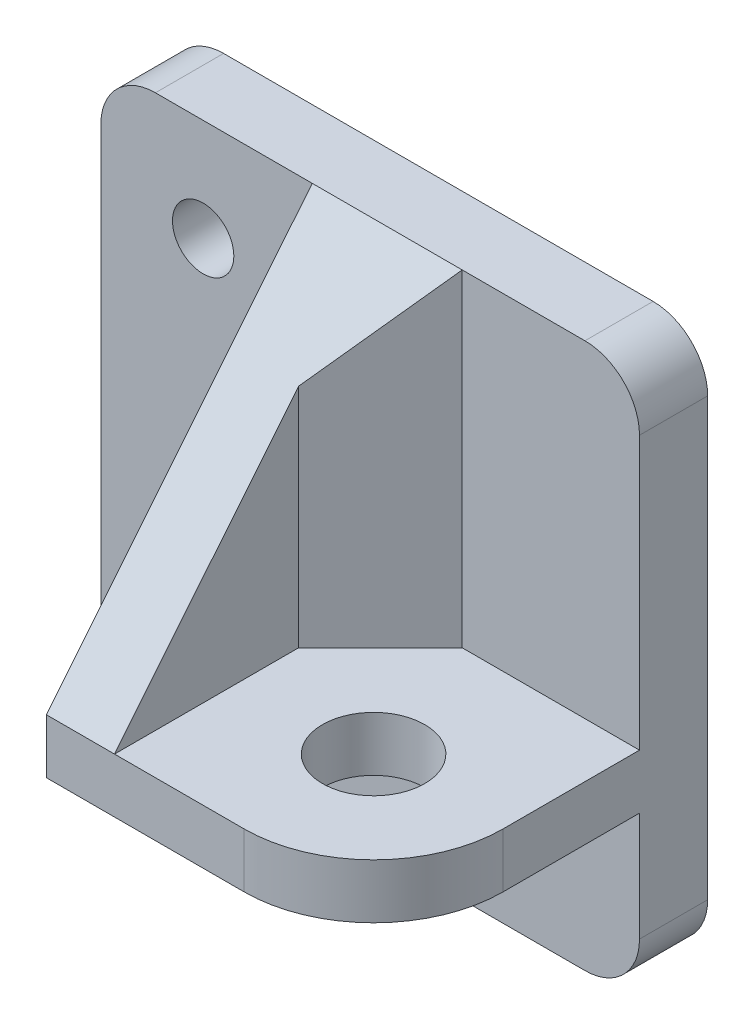
ISO-10303-21;
HEADER;
FILE_DESCRIPTION(('STEP AP214'),'2;1');
FILE_NAME('part.step','',(''),(''),'','','');
FILE_SCHEMA(('AUTOMOTIVE_DESIGN { 1 0 10303 214 1 1 1 1 }'));
ENDSEC;
DATA;
#1=APPLICATION_CONTEXT('core data for automotive mechanical design processes');
#2=APPLICATION_PROTOCOL_DEFINITION('international standard','automotive_design',2000,#1);
#3=PRODUCT_CONTEXT('',#1,'mechanical');
#4=PRODUCT('Part','Part','',(#3));
#5=PRODUCT_RELATED_PRODUCT_CATEGORY('part','',(#4));
#6=PRODUCT_DEFINITION_FORMATION('','',#4);
#7=PRODUCT_DEFINITION_CONTEXT('part definition',#1,'design');
#8=PRODUCT_DEFINITION('design','',#6,#7);
#9=PRODUCT_DEFINITION_SHAPE('','',#8);
#10=(LENGTH_UNIT() NAMED_UNIT(*) SI_UNIT(.MILLI.,.METRE.));
#11=(NAMED_UNIT(*) PLANE_ANGLE_UNIT() SI_UNIT($,.RADIAN.));
#12=(NAMED_UNIT(*) SI_UNIT($,.STERADIAN.) SOLID_ANGLE_UNIT());
#13=UNCERTAINTY_MEASURE_WITH_UNIT(LENGTH_MEASURE(1.E-05),#10,'distance_accuracy_value','');
#14=(GEOMETRIC_REPRESENTATION_CONTEXT(3) GLOBAL_UNCERTAINTY_ASSIGNED_CONTEXT((#13)) GLOBAL_UNIT_ASSIGNED_CONTEXT((#10,
#11,#12)) REPRESENTATION_CONTEXT('',''));
#15=CARTESIAN_POINT('',(0.,0.,0.));
#16=DIRECTION('',(0.,0.,1.));
#17=DIRECTION('',(1.,0.,0.));
#18=AXIS2_PLACEMENT_3D('',#15,#16,#17);
#19=CARTESIAN_POINT('',(0.,0.,5.));
#20=DIRECTION('',(0.,0.,1.));
#21=DIRECTION('',(1.,0.,0.));
#22=AXIS2_PLACEMENT_3D('',#19,#20,#21);
#23=PLANE('',#22);
#24=CARTESIAN_POINT('',(0.,12.5,5.));
#25=DIRECTION('',(0.,0.,1.));
#26=DIRECTION('',(1.,0.,0.));
#27=AXIS2_PLACEMENT_3D('',#24,#25,#26);
#28=CIRCLE('',#27,2.25);
#29=CARTESIAN_POINT('',(2.25,12.5,5.));
#30=VERTEX_POINT('',#29);
#31=EDGE_CURVE('E242',#30,#30,#28,.T.);
#32=ORIENTED_EDGE('',*,*,#31,.F.);
#33=EDGE_LOOP('',(#32));
#34=FACE_BOUND('',#33,.T.);
#35=CARTESIAN_POINT('',(0.,-12.5,5.));
#36=DIRECTION('',(0.,0.,1.));
#37=DIRECTION('',(1.,0.,0.));
#38=AXIS2_PLACEMENT_3D('',#35,#36,#37);
#39=CIRCLE('',#38,2.25);
#40=CARTESIAN_POINT('',(2.25,-12.5,5.));
#41=VERTEX_POINT('',#40);
#42=EDGE_CURVE('E236',#41,#41,#39,.T.);
#43=ORIENTED_EDGE('',*,*,#42,.F.);
#44=EDGE_LOOP('',(#43));
#45=FACE_BOUND('',#44,.T.);
#46=DIRECTION('',(1.,0.,0.));
#47=VECTOR('',#46,1.);
#48=CARTESIAN_POINT('',(-7.49999999999999,-20.,5.));
#49=LINE('',#48,#47);
#50=CARTESIAN_POINT('',(-3.5,-20.,5.));
#51=VERTEX_POINT('',#50);
#52=CARTESIAN_POINT('',(28.,-20.,5.));
#53=VERTEX_POINT('',#52);
#54=EDGE_CURVE('E251',#51,#53,#49,.T.);
#55=ORIENTED_EDGE('',*,*,#54,.T.);
#56=CARTESIAN_POINT('',(28.,-16.,5.));
#57=DIRECTION('',(0.,0.,1.));
#58=DIRECTION('',(1.,0.,0.));
#59=AXIS2_PLACEMENT_3D('',#56,#57,#58);
#60=CIRCLE('',#59,4.);
#61=CARTESIAN_POINT('',(32.,-16.,5.));
#62=VERTEX_POINT('',#61);
#63=EDGE_CURVE('E290',#53,#62,#60,.T.);
#64=ORIENTED_EDGE('',*,*,#63,.T.);
#65=DIRECTION('',(0.,1.,0.));
#66=VECTOR('',#65,1.);
#67=CARTESIAN_POINT('',(32.,20.,5.));
#68=LINE('',#67,#66);
#69=CARTESIAN_POINT('',(32.,-8.,5.));
#70=VERTEX_POINT('',#69);
#71=EDGE_CURVE('E152',#62,#70,#68,.T.);
#72=ORIENTED_EDGE('',*,*,#71,.T.);
#73=DIRECTION('',(1.,0.,0.));
#74=VECTOR('',#73,1.);
#75=CARTESIAN_POINT('',(32.,-8.,5.));
#76=LINE('',#75,#74);
#77=CARTESIAN_POINT('',(7.99999999999999,-8.,5.));
#78=VERTEX_POINT('',#77);
#79=EDGE_CURVE('E145',#78,#70,#76,.T.);
#80=ORIENTED_EDGE('',*,*,#79,.F.);
#81=DIRECTION('',(0.,-1.,0.));
#82=VECTOR('',#81,1.);
#83=CARTESIAN_POINT('',(7.99999999999999,-8.,5.));
#84=LINE('',#83,#82);
#85=CARTESIAN_POINT('',(7.99999999999999,20.,5.));
#86=VERTEX_POINT('',#85);
#87=EDGE_CURVE('E150',#86,#78,#84,.T.);
#88=ORIENTED_EDGE('',*,*,#87,.F.);
#89=DIRECTION('',(-1.,0.,0.));
#90=VECTOR('',#89,1.);
#91=CARTESIAN_POINT('',(-7.5,20.,5.));
#92=LINE('',#91,#90);
#93=CARTESIAN_POINT('',(-3.5,20.,5.));
#94=VERTEX_POINT('',#93);
#95=EDGE_CURVE('E266',#86,#94,#92,.T.);
#96=ORIENTED_EDGE('',*,*,#95,.T.);
#97=CARTESIAN_POINT('',(-3.5,16.,5.));
#98=DIRECTION('',(0.,0.,1.));
#99=DIRECTION('',(1.,0.,0.));
#100=AXIS2_PLACEMENT_3D('',#97,#98,#99);
#101=CIRCLE('',#100,4.);
#102=CARTESIAN_POINT('',(-7.5,16.,5.));
#103=VERTEX_POINT('',#102);
#104=EDGE_CURVE('E286',#94,#103,#101,.T.);
#105=ORIENTED_EDGE('',*,*,#104,.T.);
#106=DIRECTION('',(0.,-1.,0.));
#107=VECTOR('',#106,1.);
#108=CARTESIAN_POINT('',(-7.5,20.,5.));
#109=LINE('',#108,#107);
#110=CARTESIAN_POINT('',(-7.5,-16.,5.));
#111=VERTEX_POINT('',#110);
#112=EDGE_CURVE('E248',#103,#111,#109,.T.);
#113=ORIENTED_EDGE('',*,*,#112,.T.);
#114=CARTESIAN_POINT('',(-3.5,-16.,5.));
#115=DIRECTION('',(0.,0.,1.));
#116=DIRECTION('',(1.,0.,0.));
#117=AXIS2_PLACEMENT_3D('',#114,#115,#116);
#118=CIRCLE('',#117,4.);
#119=EDGE_CURVE('E288',#111,#51,#118,.T.);
#120=ORIENTED_EDGE('',*,*,#119,.T.);
#121=EDGE_LOOP('',(#55,#64,#72,#80,#88,#96,#105,#113,#120));
#122=FACE_BOUND('',#121,.T.);
#123=ADVANCED_FACE('F32',(#34,#45,#122),#23,.T.);
#124=CARTESIAN_POINT('',(28.,20.,5.));
#125=VERTEX_POINT('',#124);
#126=CARTESIAN_POINT('',(19.,20.,5.));
#127=VERTEX_POINT('',#126);
#128=EDGE_CURVE('E257',#125,#127,#92,.T.);
#129=ORIENTED_EDGE('',*,*,#128,.T.);
#130=DIRECTION('',(0.,-1.,0.));
#131=VECTOR('',#130,1.);
#132=CARTESIAN_POINT('',(19.,-4.,5.));
#133=LINE('',#132,#131);
#134=CARTESIAN_POINT('',(19.,-4.,5.));
#135=VERTEX_POINT('',#134);
#136=EDGE_CURVE('E206',#127,#135,#133,.T.);
#137=ORIENTED_EDGE('',*,*,#136,.T.);
#138=DIRECTION('',(1.,0.,0.));
#139=VECTOR('',#138,1.);
#140=CARTESIAN_POINT('',(32.,-4.,5.));
#141=LINE('',#140,#139);
#142=CARTESIAN_POINT('',(32.,-4.,5.));
#143=VERTEX_POINT('',#142);
#144=EDGE_CURVE('E195',#135,#143,#141,.T.);
#145=ORIENTED_EDGE('',*,*,#144,.T.);
#146=CARTESIAN_POINT('',(32.,16.,5.));
#147=VERTEX_POINT('',#146);
#148=EDGE_CURVE('E254',#143,#147,#68,.T.);
#149=ORIENTED_EDGE('',*,*,#148,.T.);
#150=CARTESIAN_POINT('',(28.,16.,5.));
#151=DIRECTION('',(0.,0.,1.));
#152=DIRECTION('',(1.,0.,0.));
#153=AXIS2_PLACEMENT_3D('',#150,#151,#152);
#154=CIRCLE('',#153,4.);
#155=EDGE_CURVE('E297',#147,#125,#154,.T.);
#156=ORIENTED_EDGE('',*,*,#155,.T.);
#157=EDGE_LOOP('',(#129,#137,#145,#149,#156));
#158=FACE_BOUND('',#157,.T.);
#159=ADVANCED_FACE('F342',(#158),#23,.T.);
#160=CARTESIAN_POINT('',(0.,0.,0.));
#161=DIRECTION('',(0.,0.,1.));
#162=DIRECTION('',(1.,0.,0.));
#163=AXIS2_PLACEMENT_3D('',#160,#161,#162);
#164=PLANE('',#163);
#165=CARTESIAN_POINT('',(0.,12.5,0.));
#166=DIRECTION('',(0.,0.,1.));
#167=DIRECTION('',(1.,0.,0.));
#168=AXIS2_PLACEMENT_3D('',#165,#166,#167);
#169=CIRCLE('',#168,2.25);
#170=CARTESIAN_POINT('',(2.25,12.5,0.));
#171=VERTEX_POINT('',#170);
#172=EDGE_CURVE('E239',#171,#171,#169,.T.);
#173=ORIENTED_EDGE('',*,*,#172,.T.);
#174=EDGE_LOOP('',(#173));
#175=FACE_BOUND('',#174,.T.);
#176=DIRECTION('',(0.,1.,0.));
#177=VECTOR('',#176,1.);
#178=CARTESIAN_POINT('',(32.,20.,0.));
#179=LINE('',#178,#177);
#180=CARTESIAN_POINT('',(32.,-16.,0.));
#181=VERTEX_POINT('',#180);
#182=CARTESIAN_POINT('',(32.,16.,0.));
#183=VERTEX_POINT('',#182);
#184=EDGE_CURVE('E323',#181,#183,#179,.T.);
#185=ORIENTED_EDGE('',*,*,#184,.F.);
#186=CARTESIAN_POINT('',(28.,-16.,0.));
#187=DIRECTION('',(0.,0.,1.));
#188=DIRECTION('',(1.,0.,0.));
#189=AXIS2_PLACEMENT_3D('',#186,#187,#188);
#190=CIRCLE('',#189,4.);
#191=CARTESIAN_POINT('',(28.,-20.,0.));
#192=VERTEX_POINT('',#191);
#193=EDGE_CURVE('E279',#181,#192,#190,.F.);
#194=ORIENTED_EDGE('',*,*,#193,.T.);
#195=DIRECTION('',(1.,0.,0.));
#196=VECTOR('',#195,1.);
#197=CARTESIAN_POINT('',(-7.49999999999999,-20.,0.));
#198=LINE('',#197,#196);
#199=CARTESIAN_POINT('',(-3.5,-20.,0.));
#200=VERTEX_POINT('',#199);
#201=EDGE_CURVE('E317',#200,#192,#198,.T.);
#202=ORIENTED_EDGE('',*,*,#201,.F.);
#203=CARTESIAN_POINT('',(-3.5,-16.,0.));
#204=DIRECTION('',(0.,0.,1.));
#205=DIRECTION('',(1.,0.,0.));
#206=AXIS2_PLACEMENT_3D('',#203,#204,#205);
#207=CIRCLE('',#206,4.);
#208=CARTESIAN_POINT('',(-7.5,-16.,0.));
#209=VERTEX_POINT('',#208);
#210=EDGE_CURVE('E275',#200,#209,#207,.F.);
#211=ORIENTED_EDGE('',*,*,#210,.T.);
#212=DIRECTION('',(0.,-1.,0.));
#213=VECTOR('',#212,1.);
#214=CARTESIAN_POINT('',(-7.5,20.,0.));
#215=LINE('',#214,#213);
#216=CARTESIAN_POINT('',(-7.5,16.,0.));
#217=VERTEX_POINT('',#216);
#218=EDGE_CURVE('E245',#217,#209,#215,.T.);
#219=ORIENTED_EDGE('',*,*,#218,.F.);
#220=CARTESIAN_POINT('',(-3.5,16.,0.));
#221=DIRECTION('',(0.,0.,1.));
#222=DIRECTION('',(1.,0.,0.));
#223=AXIS2_PLACEMENT_3D('',#220,#221,#222);
#224=CIRCLE('',#223,4.);
#225=CARTESIAN_POINT('',(-3.5,20.,0.));
#226=VERTEX_POINT('',#225);
#227=EDGE_CURVE('E273',#217,#226,#224,.F.);
#228=ORIENTED_EDGE('',*,*,#227,.T.);
#229=DIRECTION('',(-1.,0.,0.));
#230=VECTOR('',#229,1.);
#231=CARTESIAN_POINT('',(-7.5,20.,0.));
#232=LINE('',#231,#230);
#233=CARTESIAN_POINT('',(28.,20.,0.));
#234=VERTEX_POINT('',#233);
#235=EDGE_CURVE('E252',#234,#226,#232,.T.);
#236=ORIENTED_EDGE('',*,*,#235,.F.);
#237=CARTESIAN_POINT('',(28.,16.,0.));
#238=DIRECTION('',(0.,0.,1.));
#239=DIRECTION('',(1.,0.,0.));
#240=AXIS2_PLACEMENT_3D('',#237,#238,#239);
#241=CIRCLE('',#240,4.);
#242=EDGE_CURVE('E277',#234,#183,#241,.F.);
#243=ORIENTED_EDGE('',*,*,#242,.T.);
#244=EDGE_LOOP('',(#185,#194,#202,#211,#219,#228,#236,#243));
#245=FACE_BOUND('',#244,.T.);
#246=CARTESIAN_POINT('',(0.,-12.5,0.));
#247=DIRECTION('',(0.,0.,1.));
#248=DIRECTION('',(1.,0.,0.));
#249=AXIS2_PLACEMENT_3D('',#246,#247,#248);
#250=CIRCLE('',#249,2.25);
#251=CARTESIAN_POINT('',(2.25,-12.5,0.));
#252=VERTEX_POINT('',#251);
#253=EDGE_CURVE('E233',#252,#252,#250,.T.);
#254=ORIENTED_EDGE('',*,*,#253,.T.);
#255=EDGE_LOOP('',(#254));
#256=FACE_BOUND('',#255,.T.);
#257=ADVANCED_FACE('F321',(#175,#245,#256),#164,.F.);
#258=CARTESIAN_POINT('',(-7.5,20.,5.));
#259=DIRECTION('',(1.,0.,0.));
#260=DIRECTION('',(0.,1.,0.));
#261=AXIS2_PLACEMENT_3D('',#258,#259,#260);
#262=PLANE('',#261);
#263=ORIENTED_EDGE('',*,*,#218,.T.);
#264=DIRECTION('',(0.,0.,-1.));
#265=VECTOR('',#264,1.);
#266=CARTESIAN_POINT('',(-7.5,-16.,5.));
#267=LINE('',#266,#265);
#268=EDGE_CURVE('E204',#209,#111,#267,.F.);
#269=ORIENTED_EDGE('',*,*,#268,.T.);
#270=ORIENTED_EDGE('',*,*,#112,.F.);
#271=DIRECTION('',(0.,0.,-1.));
#272=VECTOR('',#271,1.);
#273=CARTESIAN_POINT('',(-7.5,16.,5.));
#274=LINE('',#273,#272);
#275=EDGE_CURVE('E298',#103,#217,#274,.T.);
#276=ORIENTED_EDGE('',*,*,#275,.T.);
#277=EDGE_LOOP('',(#263,#269,#270,#276));
#278=FACE_BOUND('',#277,.T.);
#279=ADVANCED_FACE('F306',(#278),#262,.F.);
#280=CARTESIAN_POINT('',(-7.49999999999999,-20.,5.));
#281=DIRECTION('',(0.,1.,0.));
#282=DIRECTION('',(0.,0.,1.));
#283=AXIS2_PLACEMENT_3D('',#280,#281,#282);
#284=PLANE('',#283);
#285=ORIENTED_EDGE('',*,*,#201,.T.);
#286=DIRECTION('',(0.,0.,-1.));
#287=VECTOR('',#286,1.);
#288=CARTESIAN_POINT('',(28.,-20.,5.));
#289=LINE('',#288,#287);
#290=EDGE_CURVE('E284',#192,#53,#289,.F.);
#291=ORIENTED_EDGE('',*,*,#290,.T.);
#292=ORIENTED_EDGE('',*,*,#54,.F.);
#293=DIRECTION('',(0.,0.,-1.));
#294=VECTOR('',#293,1.);
#295=CARTESIAN_POINT('',(-3.5,-20.,5.));
#296=LINE('',#295,#294);
#297=EDGE_CURVE('E281',#51,#200,#296,.T.);
#298=ORIENTED_EDGE('',*,*,#297,.T.);
#299=EDGE_LOOP('',(#285,#291,#292,#298));
#300=FACE_BOUND('',#299,.T.);
#301=ADVANCED_FACE('F316',(#300),#284,.F.);
#302=CARTESIAN_POINT('',(32.,20.,5.));
#303=DIRECTION('',(-1.,0.,0.));
#304=DIRECTION('',(0.,-1.,0.));
#305=AXIS2_PLACEMENT_3D('',#302,#303,#304);
#306=PLANE('',#305);
#307=ORIENTED_EDGE('',*,*,#71,.F.);
#308=DIRECTION('',(0.,0.,-1.));
#309=VECTOR('',#308,1.);
#310=CARTESIAN_POINT('',(32.,-16.,5.));
#311=LINE('',#310,#309);
#312=EDGE_CURVE('E270',#62,#181,#311,.T.);
#313=ORIENTED_EDGE('',*,*,#312,.T.);
#314=ORIENTED_EDGE('',*,*,#184,.T.);
#315=DIRECTION('',(0.,0.,-1.));
#316=VECTOR('',#315,1.);
#317=CARTESIAN_POINT('',(32.,16.,5.));
#318=LINE('',#317,#316);
#319=EDGE_CURVE('E268',#183,#147,#318,.F.);
#320=ORIENTED_EDGE('',*,*,#319,.T.);
#321=ORIENTED_EDGE('',*,*,#148,.F.);
#322=DIRECTION('',(0.,0.,1.));
#323=VECTOR('',#322,1.);
#324=CARTESIAN_POINT('',(32.,-4.,15.));
#325=LINE('',#324,#323);
#326=CARTESIAN_POINT('',(32.,-4.,15.));
#327=VERTEX_POINT('',#326);
#328=EDGE_CURVE('E156',#143,#327,#325,.T.);
#329=ORIENTED_EDGE('',*,*,#328,.T.);
#330=DIRECTION('',(0.,-1.,0.));
#331=VECTOR('',#330,1.);
#332=CARTESIAN_POINT('',(32.,-4.,15.));
#333=LINE('',#332,#331);
#334=CARTESIAN_POINT('',(32.,-8.,15.));
#335=VERTEX_POINT('',#334);
#336=EDGE_CURVE('E203',#327,#335,#333,.T.);
#337=ORIENTED_EDGE('',*,*,#336,.T.);
#338=DIRECTION('',(0.,0.,1.));
#339=VECTOR('',#338,1.);
#340=CARTESIAN_POINT('',(32.,-8.,15.));
#341=LINE('',#340,#339);
#342=EDGE_CURVE('E184',#70,#335,#341,.T.);
#343=ORIENTED_EDGE('',*,*,#342,.F.);
#344=EDGE_LOOP('',(#307,#313,#314,#320,#321,#329,#337,#343));
#345=FACE_BOUND('',#344,.T.);
#346=ADVANCED_FACE('F360',(#345),#306,.F.);
#347=CARTESIAN_POINT('',(-7.5,20.,5.));
#348=DIRECTION('',(0.,-1.,0.));
#349=DIRECTION('',(1.,0.,0.));
#350=AXIS2_PLACEMENT_3D('',#347,#348,#349);
#351=PLANE('',#350);
#352=ORIENTED_EDGE('',*,*,#128,.F.);
#353=DIRECTION('',(0.,0.,-1.));
#354=VECTOR('',#353,1.);
#355=CARTESIAN_POINT('',(28.,20.,5.));
#356=LINE('',#355,#354);
#357=EDGE_CURVE('E294',#125,#234,#356,.T.);
#358=ORIENTED_EDGE('',*,*,#357,.T.);
#359=ORIENTED_EDGE('',*,*,#235,.T.);
#360=DIRECTION('',(0.,0.,-1.));
#361=VECTOR('',#360,1.);
#362=CARTESIAN_POINT('',(-3.5,20.,5.));
#363=LINE('',#362,#361);
#364=EDGE_CURVE('E292',#226,#94,#363,.F.);
#365=ORIENTED_EDGE('',*,*,#364,.T.);
#366=ORIENTED_EDGE('',*,*,#95,.F.);
#367=DIRECTION('',(1.,0.,0.));
#368=VECTOR('',#367,1.);
#369=CARTESIAN_POINT('',(7.99999999999999,20.,5.));
#370=LINE('',#369,#368);
#371=EDGE_CURVE('E47',#86,#127,#370,.T.);
#372=ORIENTED_EDGE('',*,*,#371,.T.);
#373=EDGE_LOOP('',(#352,#358,#359,#365,#366,#372));
#374=FACE_BOUND('',#373,.T.);
#375=ADVANCED_FACE('F330',(#374),#351,.F.);
#376=CARTESIAN_POINT('',(0.,12.5,5.));
#377=DIRECTION('',(0.,0.,-1.));
#378=DIRECTION('',(-1.,0.,0.));
#379=AXIS2_PLACEMENT_3D('',#376,#377,#378);
#380=CYLINDRICAL_SURFACE('',#379,2.25);
#381=ORIENTED_EDGE('',*,*,#31,.T.);
#382=EDGE_LOOP('',(#381));
#383=FACE_BOUND('',#382,.T.);
#384=ORIENTED_EDGE('',*,*,#172,.F.);
#385=EDGE_LOOP('',(#384));
#386=FACE_BOUND('',#385,.T.);
#387=ADVANCED_FACE('F353',(#383,#386),#380,.F.);
#388=CARTESIAN_POINT('',(0.,-12.5,5.));
#389=DIRECTION('',(0.,0.,-1.));
#390=DIRECTION('',(-1.,0.,0.));
#391=AXIS2_PLACEMENT_3D('',#388,#389,#390);
#392=CYLINDRICAL_SURFACE('',#391,2.25);
#393=ORIENTED_EDGE('',*,*,#42,.T.);
#394=EDGE_LOOP('',(#393));
#395=FACE_BOUND('',#394,.T.);
#396=ORIENTED_EDGE('',*,*,#253,.F.);
#397=EDGE_LOOP('',(#396));
#398=FACE_BOUND('',#397,.T.);
#399=ADVANCED_FACE('F504',(#395,#398),#392,.F.);
#400=CARTESIAN_POINT('',(22.5,-4.,24.5));
#401=DIRECTION('',(0.,0.,1.));
#402=DIRECTION('',(1.,0.,0.));
#403=AXIS2_PLACEMENT_3D('',#400,#401,#402);
#404=PLANE('',#403);
#405=DIRECTION('',(-1.,0.,0.));
#406=VECTOR('',#405,1.);
#407=CARTESIAN_POINT('',(22.5,-8.,24.5));
#408=LINE('',#407,#406);
#409=CARTESIAN_POINT('',(22.5,-8.,24.5));
#410=VERTEX_POINT('',#409);
#411=CARTESIAN_POINT('',(7.99999999999999,-8.,24.5));
#412=VERTEX_POINT('',#411);
#413=EDGE_CURVE('E157',#410,#412,#408,.T.);
#414=ORIENTED_EDGE('',*,*,#413,.F.);
#415=DIRECTION('',(0.,-1.,0.));
#416=VECTOR('',#415,1.);
#417=CARTESIAN_POINT('',(22.5,-4.,24.5));
#418=LINE('',#417,#416);
#419=CARTESIAN_POINT('',(22.5,-4.,24.5));
#420=VERTEX_POINT('',#419);
#421=EDGE_CURVE('E225',#420,#410,#418,.T.);
#422=ORIENTED_EDGE('',*,*,#421,.F.);
#423=DIRECTION('',(-1.,0.,0.));
#424=VECTOR('',#423,1.);
#425=CARTESIAN_POINT('',(22.5,-4.,24.5));
#426=LINE('',#425,#424);
#427=CARTESIAN_POINT('',(13.,-4.,24.5));
#428=VERTEX_POINT('',#427);
#429=EDGE_CURVE('E190',#420,#428,#426,.T.);
#430=ORIENTED_EDGE('',*,*,#429,.T.);
#431=DIRECTION('',(1.,0.,0.));
#432=VECTOR('',#431,1.);
#433=CARTESIAN_POINT('',(7.99999999999999,-4.,24.5));
#434=LINE('',#433,#432);
#435=CARTESIAN_POINT('',(7.99999999999999,-4.,24.5));
#436=VERTEX_POINT('',#435);
#437=EDGE_CURVE('E178',#436,#428,#434,.T.);
#438=ORIENTED_EDGE('',*,*,#437,.F.);
#439=DIRECTION('',(0.,1.,0.));
#440=VECTOR('',#439,1.);
#441=CARTESIAN_POINT('',(7.99999999999999,-8.,24.5));
#442=LINE('',#441,#440);
#443=EDGE_CURVE('E166',#412,#436,#442,.T.);
#444=ORIENTED_EDGE('',*,*,#443,.F.);
#445=EDGE_LOOP('',(#414,#422,#430,#438,#444));
#446=FACE_BOUND('',#445,.T.);
#447=ADVANCED_FACE('F224',(#446),#404,.T.);
#448=CARTESIAN_POINT('',(22.5,-4.,15.));
#449=DIRECTION('',(0.,-1.,0.));
#450=DIRECTION('',(0.,0.,-1.));
#451=AXIS2_PLACEMENT_3D('',#448,#449,#450);
#452=CYLINDRICAL_SURFACE('',#451,9.50000000000001);
#453=CARTESIAN_POINT('',(22.5,-8.,15.));
#454=DIRECTION('',(0.,-1.,0.));
#455=DIRECTION('',(0.,0.,1.));
#456=AXIS2_PLACEMENT_3D('',#453,#454,#455);
#457=CIRCLE('',#456,9.50000000000001);
#458=EDGE_CURVE('E198',#335,#410,#457,.T.);
#459=ORIENTED_EDGE('',*,*,#458,.F.);
#460=ORIENTED_EDGE('',*,*,#336,.F.);
#461=CARTESIAN_POINT('',(22.5,-4.,15.));
#462=DIRECTION('',(0.,-1.,0.));
#463=DIRECTION('',(0.,0.,1.));
#464=AXIS2_PLACEMENT_3D('',#461,#462,#463);
#465=CIRCLE('',#464,9.50000000000001);
#466=EDGE_CURVE('E187',#327,#420,#465,.T.);
#467=ORIENTED_EDGE('',*,*,#466,.T.);
#468=ORIENTED_EDGE('',*,*,#421,.T.);
#469=EDGE_LOOP('',(#459,#460,#467,#468));
#470=FACE_BOUND('',#469,.T.);
#471=ADVANCED_FACE('F230',(#470),#452,.T.);
#472=CARTESIAN_POINT('',(22.5,-4.,15.));
#473=DIRECTION('',(0.,1.,0.));
#474=DIRECTION('',(0.,0.,1.));
#475=AXIS2_PLACEMENT_3D('',#472,#473,#474);
#476=PLANE('',#475);
#477=CARTESIAN_POINT('',(22.5,-4.,15.));
#478=DIRECTION('',(0.,-1.,0.));
#479=DIRECTION('',(0.,0.,-1.));
#480=AXIS2_PLACEMENT_3D('',#477,#478,#479);
#481=CIRCLE('',#480,3.75);
#482=CARTESIAN_POINT('',(22.5,-4.,11.25));
#483=VERTEX_POINT('',#482);
#484=EDGE_CURVE('E181',#483,#483,#481,.T.);
#485=ORIENTED_EDGE('',*,*,#484,.T.);
#486=EDGE_LOOP('',(#485));
#487=FACE_BOUND('',#486,.T.);
#488=ORIENTED_EDGE('',*,*,#144,.F.);
#489=DIRECTION('',(0.707106781186551,0.,-0.707106781186544));
#490=VECTOR('',#489,1.);
#491=CARTESIAN_POINT('',(15.75,-4.,8.24999999999998));
#492=LINE('',#491,#490);
#493=CARTESIAN_POINT('',(13.,-4.,11.));
#494=VERTEX_POINT('',#493);
#495=EDGE_CURVE('E209',#135,#494,#492,.F.);
#496=ORIENTED_EDGE('',*,*,#495,.T.);
#497=DIRECTION('',(0.,0.,-1.));
#498=VECTOR('',#497,1.);
#499=CARTESIAN_POINT('',(13.,-4.,5.));
#500=LINE('',#499,#498);
#501=EDGE_CURVE('E193',#428,#494,#500,.T.);
#502=ORIENTED_EDGE('',*,*,#501,.F.);
#503=ORIENTED_EDGE('',*,*,#429,.F.);
#504=ORIENTED_EDGE('',*,*,#466,.F.);
#505=ORIENTED_EDGE('',*,*,#328,.F.);
#506=EDGE_LOOP('',(#488,#496,#502,#503,#504,#505));
#507=FACE_BOUND('',#506,.T.);
#508=ADVANCED_FACE('F213',(#487,#507),#476,.T.);
#509=CARTESIAN_POINT('',(22.5,-8.,15.));
#510=DIRECTION('',(0.,1.,0.));
#511=DIRECTION('',(0.,0.,1.));
#512=AXIS2_PLACEMENT_3D('',#509,#510,#511);
#513=PLANE('',#512);
#514=CARTESIAN_POINT('',(22.5,-8.,15.));
#515=DIRECTION('',(0.,-1.,0.));
#516=DIRECTION('',(0.,0.,-1.));
#517=AXIS2_PLACEMENT_3D('',#514,#515,#516);
#518=CIRCLE('',#517,3.75);
#519=CARTESIAN_POINT('',(22.5,-8.,11.25));
#520=VERTEX_POINT('',#519);
#521=EDGE_CURVE('E180',#520,#520,#518,.T.);
#522=ORIENTED_EDGE('',*,*,#521,.F.);
#523=EDGE_LOOP('',(#522));
#524=FACE_BOUND('',#523,.T.);
#525=ORIENTED_EDGE('',*,*,#342,.T.);
#526=ORIENTED_EDGE('',*,*,#458,.T.);
#527=ORIENTED_EDGE('',*,*,#413,.T.);
#528=DIRECTION('',(0.,0.,1.));
#529=VECTOR('',#528,1.);
#530=CARTESIAN_POINT('',(7.99999999999999,-8.,5.));
#531=LINE('',#530,#529);
#532=EDGE_CURVE('E160',#78,#412,#531,.T.);
#533=ORIENTED_EDGE('',*,*,#532,.F.);
#534=ORIENTED_EDGE('',*,*,#79,.T.);
#535=EDGE_LOOP('',(#525,#526,#527,#533,#534));
#536=FACE_BOUND('',#535,.T.);
#537=ADVANCED_FACE('F161',(#524,#536),#513,.F.);
#538=CARTESIAN_POINT('',(22.5,-4.,15.));
#539=DIRECTION('',(0.,-1.,0.));
#540=DIRECTION('',(0.,0.,-1.));
#541=AXIS2_PLACEMENT_3D('',#538,#539,#540);
#542=CYLINDRICAL_SURFACE('',#541,3.75);
#543=ORIENTED_EDGE('',*,*,#484,.F.);
#544=EDGE_LOOP('',(#543));
#545=FACE_BOUND('',#544,.T.);
#546=ORIENTED_EDGE('',*,*,#521,.T.);
#547=EDGE_LOOP('',(#546));
#548=FACE_BOUND('',#547,.T.);
#549=ADVANCED_FACE('F436',(#545,#548),#542,.F.);
#550=CARTESIAN_POINT('',(7.99999999999999,-4.,24.5));
#551=DIRECTION('',(0.,-0.630592625094466,-0.776114000116265));
#552=DIRECTION('',(0.,0.776114000116265,-0.630592625094466));
#553=AXIS2_PLACEMENT_3D('',#550,#551,#552);
#554=PLANE('',#553);
#555=DIRECTION('',(0.,0.776114000116266,-0.630592625094466));
#556=VECTOR('',#555,1.);
#557=CARTESIAN_POINT('',(13.,-4.,24.5));
#558=LINE('',#557,#556);
#559=CARTESIAN_POINT('',(13.,12.6153846153846,11.));
#560=VERTEX_POINT('',#559);
#561=EDGE_CURVE('E171',#428,#560,#558,.T.);
#562=ORIENTED_EDGE('',*,*,#561,.T.);
#563=DIRECTION('',(-0.533396460910445,-0.656487951889773,0.533396460910441));
#564=VECTOR('',#563,1.);
#565=CARTESIAN_POINT('',(1.91835016835009,-1.02356902356896,22.0816498316498));
#566=LINE('',#565,#564);
#567=EDGE_CURVE('E11',#560,#127,#566,.F.);
#568=ORIENTED_EDGE('',*,*,#567,.T.);
#569=ORIENTED_EDGE('',*,*,#371,.F.);
#570=DIRECTION('',(0.,0.776114000116266,-0.630592625094466));
#571=VECTOR('',#570,1.);
#572=CARTESIAN_POINT('',(7.99999999999999,-4.,24.5));
#573=LINE('',#572,#571);
#574=EDGE_CURVE('E170',#436,#86,#573,.T.);
#575=ORIENTED_EDGE('',*,*,#574,.F.);
#576=ORIENTED_EDGE('',*,*,#437,.T.);
#577=EDGE_LOOP('',(#562,#568,#569,#575,#576));
#578=FACE_BOUND('',#577,.T.);
#579=ADVANCED_FACE('F221',(#578),#554,.F.);
#580=CARTESIAN_POINT('',(7.99999999999999,0.,0.));
#581=DIRECTION('',(1.,0.,0.));
#582=DIRECTION('',(0.,0.,-1.));
#583=AXIS2_PLACEMENT_3D('',#580,#581,#582);
#584=PLANE('',#583);
#585=ORIENTED_EDGE('',*,*,#87,.T.);
#586=ORIENTED_EDGE('',*,*,#532,.T.);
#587=ORIENTED_EDGE('',*,*,#443,.T.);
#588=ORIENTED_EDGE('',*,*,#574,.T.);
#589=EDGE_LOOP('',(#585,#586,#587,#588));
#590=FACE_BOUND('',#589,.T.);
#591=ADVANCED_FACE('F168',(#590),#584,.F.);
#592=CARTESIAN_POINT('',(13.,0.,0.));
#593=DIRECTION('',(1.,0.,0.));
#594=DIRECTION('',(0.,0.,-1.));
#595=AXIS2_PLACEMENT_3D('',#592,#593,#594);
#596=PLANE('',#595);
#597=ORIENTED_EDGE('',*,*,#501,.T.);
#598=DIRECTION('',(0.,1.,0.));
#599=VECTOR('',#598,1.);
#600=CARTESIAN_POINT('',(13.,20.,11.));
#601=LINE('',#600,#599);
#602=EDGE_CURVE('E40',#494,#560,#601,.T.);
#603=ORIENTED_EDGE('',*,*,#602,.T.);
#604=ORIENTED_EDGE('',*,*,#561,.F.);
#605=EDGE_LOOP('',(#597,#603,#604));
#606=FACE_BOUND('',#605,.T.);
#607=ADVANCED_FACE('F218',(#606),#596,.T.);
#608=CARTESIAN_POINT('',(28.,-16.,5.));
#609=DIRECTION('',(0.,0.,-1.));
#610=DIRECTION('',(-1.,0.,0.));
#611=AXIS2_PLACEMENT_3D('',#608,#609,#610);
#612=CYLINDRICAL_SURFACE('',#611,4.);
#613=ORIENTED_EDGE('',*,*,#63,.F.);
#614=ORIENTED_EDGE('',*,*,#290,.F.);
#615=ORIENTED_EDGE('',*,*,#193,.F.);
#616=ORIENTED_EDGE('',*,*,#312,.F.);
#617=EDGE_LOOP('',(#613,#614,#615,#616));
#618=FACE_BOUND('',#617,.T.);
#619=ADVANCED_FACE('F367',(#618),#612,.T.);
#620=CARTESIAN_POINT('',(28.,16.,5.));
#621=DIRECTION('',(0.,0.,-1.));
#622=DIRECTION('',(-1.,0.,0.));
#623=AXIS2_PLACEMENT_3D('',#620,#621,#622);
#624=CYLINDRICAL_SURFACE('',#623,4.);
#625=ORIENTED_EDGE('',*,*,#155,.F.);
#626=ORIENTED_EDGE('',*,*,#319,.F.);
#627=ORIENTED_EDGE('',*,*,#242,.F.);
#628=ORIENTED_EDGE('',*,*,#357,.F.);
#629=EDGE_LOOP('',(#625,#626,#627,#628));
#630=FACE_BOUND('',#629,.T.);
#631=ADVANCED_FACE('F339',(#630),#624,.T.);
#632=CARTESIAN_POINT('',(-3.5,-16.,5.));
#633=DIRECTION('',(0.,0.,-1.));
#634=DIRECTION('',(-1.,0.,0.));
#635=AXIS2_PLACEMENT_3D('',#632,#633,#634);
#636=CYLINDRICAL_SURFACE('',#635,4.);
#637=ORIENTED_EDGE('',*,*,#119,.F.);
#638=ORIENTED_EDGE('',*,*,#268,.F.);
#639=ORIENTED_EDGE('',*,*,#210,.F.);
#640=ORIENTED_EDGE('',*,*,#297,.F.);
#641=EDGE_LOOP('',(#637,#638,#639,#640));
#642=FACE_BOUND('',#641,.T.);
#643=ADVANCED_FACE('F312',(#642),#636,.T.);
#644=CARTESIAN_POINT('',(-3.5,16.,5.));
#645=DIRECTION('',(0.,0.,-1.));
#646=DIRECTION('',(-1.,0.,0.));
#647=AXIS2_PLACEMENT_3D('',#644,#645,#646);
#648=CYLINDRICAL_SURFACE('',#647,4.);
#649=ORIENTED_EDGE('',*,*,#104,.F.);
#650=ORIENTED_EDGE('',*,*,#364,.F.);
#651=ORIENTED_EDGE('',*,*,#227,.F.);
#652=ORIENTED_EDGE('',*,*,#275,.F.);
#653=EDGE_LOOP('',(#649,#650,#651,#652));
#654=FACE_BOUND('',#653,.T.);
#655=ADVANCED_FACE('F333',(#654),#648,.T.);
#656=CARTESIAN_POINT('',(19.,0.,5.));
#657=DIRECTION('',(0.707106781186544,0.,0.707106781186551));
#658=DIRECTION('',(0.,1.,0.));
#659=AXIS2_PLACEMENT_3D('',#656,#657,#658);
#660=PLANE('',#659);
#661=ORIENTED_EDGE('',*,*,#567,.F.);
#662=ORIENTED_EDGE('',*,*,#602,.F.);
#663=ORIENTED_EDGE('',*,*,#495,.F.);
#664=ORIENTED_EDGE('',*,*,#136,.F.);
#665=EDGE_LOOP('',(#661,#662,#663,#664));
#666=FACE_BOUND('',#665,.T.);
#667=ADVANCED_FACE('F34',(#666),#660,.T.);
#668=CLOSED_SHELL('',(#123,#159,#257,#279,#301,#346,#375,#387,#399,#447,#471,#508,#537,#549,
#579,#591,#607,#619,#631,#643,#655,#667));
#669=MANIFOLD_SOLID_BREP('B2',#668);
#670=ADVANCED_BREP_SHAPE_REPRESENTATION('',(#18,#669),#14);
#671=SHAPE_DEFINITION_REPRESENTATION(#9,#670);
ENDSEC;
END-ISO-10303-21;
